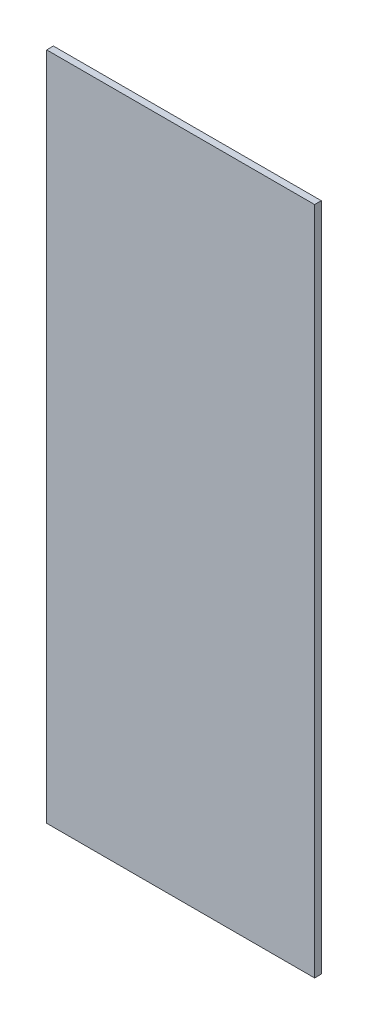
ISO-10303-21;
HEADER;
FILE_DESCRIPTION(('STEP AP214'),'2;1');
FILE_NAME('part.step','',(''),(''),'','','');
FILE_SCHEMA(('AUTOMOTIVE_DESIGN { 1 0 10303 214 1 1 1 1 }'));
ENDSEC;
DATA;
#1=APPLICATION_CONTEXT('core data for automotive mechanical design processes');
#2=APPLICATION_PROTOCOL_DEFINITION('international standard','automotive_design',2000,#1);
#3=PRODUCT_CONTEXT('',#1,'mechanical');
#4=PRODUCT('Part','Part','',(#3));
#5=PRODUCT_RELATED_PRODUCT_CATEGORY('part','',(#4));
#6=PRODUCT_DEFINITION_FORMATION('','',#4);
#7=PRODUCT_DEFINITION_CONTEXT('part definition',#1,'design');
#8=PRODUCT_DEFINITION('design','',#6,#7);
#9=PRODUCT_DEFINITION_SHAPE('','',#8);
#10=(LENGTH_UNIT() NAMED_UNIT(*) SI_UNIT(.MILLI.,.METRE.));
#11=(NAMED_UNIT(*) PLANE_ANGLE_UNIT() SI_UNIT($,.RADIAN.));
#12=(NAMED_UNIT(*) SI_UNIT($,.STERADIAN.) SOLID_ANGLE_UNIT());
#13=UNCERTAINTY_MEASURE_WITH_UNIT(LENGTH_MEASURE(1.E-05),#10,'distance_accuracy_value','');
#14=(GEOMETRIC_REPRESENTATION_CONTEXT(3) GLOBAL_UNCERTAINTY_ASSIGNED_CONTEXT((#13)) GLOBAL_UNIT_ASSIGNED_CONTEXT((#10,
#11,#12)) REPRESENTATION_CONTEXT('',''));
#15=CARTESIAN_POINT('',(0.,0.,0.));
#16=DIRECTION('',(0.,0.,1.));
#17=DIRECTION('',(1.,0.,0.));
#18=AXIS2_PLACEMENT_3D('',#15,#16,#17);
#19=CARTESIAN_POINT('',(63.5,158.75,3.175));
#20=DIRECTION('',(0.,-1.,0.));
#21=DIRECTION('',(0.,0.,-1.));
#22=AXIS2_PLACEMENT_3D('',#19,#20,#21);
#23=PLANE('',#22);
#24=DIRECTION('',(-1.,0.,0.));
#25=VECTOR('',#24,1.);
#26=CARTESIAN_POINT('',(63.5,158.75,0.));
#27=LINE('',#26,#25);
#28=CARTESIAN_POINT('',(63.5,158.75,0.));
#29=VERTEX_POINT('',#28);
#30=CARTESIAN_POINT('',(-63.5,158.75,0.));
#31=VERTEX_POINT('',#30);
#32=EDGE_CURVE('E113',#29,#31,#27,.T.);
#33=ORIENTED_EDGE('',*,*,#32,.T.);
#34=DIRECTION('',(0.,0.,-1.));
#35=VECTOR('',#34,1.);
#36=CARTESIAN_POINT('',(-63.5,158.75,3.175));
#37=LINE('',#36,#35);
#38=CARTESIAN_POINT('',(-63.5,158.75,3.175));
#39=VERTEX_POINT('',#38);
#40=EDGE_CURVE('E11',#39,#31,#37,.T.);
#41=ORIENTED_EDGE('',*,*,#40,.F.);
#42=DIRECTION('',(-1.,0.,0.));
#43=VECTOR('',#42,1.);
#44=CARTESIAN_POINT('',(63.5,158.75,3.175));
#45=LINE('',#44,#43);
#46=CARTESIAN_POINT('',(63.5,158.75,3.175));
#47=VERTEX_POINT('',#46);
#48=EDGE_CURVE('E97',#47,#39,#45,.T.);
#49=ORIENTED_EDGE('',*,*,#48,.F.);
#50=DIRECTION('',(0.,0.,-1.));
#51=VECTOR('',#50,1.);
#52=CARTESIAN_POINT('',(63.5,158.75,3.175));
#53=LINE('',#52,#51);
#54=EDGE_CURVE('E109',#47,#29,#53,.T.);
#55=ORIENTED_EDGE('',*,*,#54,.T.);
#56=EDGE_LOOP('',(#33,#41,#49,#55));
#57=FACE_BOUND('',#56,.T.);
#58=ADVANCED_FACE('F45',(#57),#23,.F.);
#59=CARTESIAN_POINT('',(-63.5,-158.75,3.175));
#60=DIRECTION('',(1.,0.,0.));
#61=DIRECTION('',(0.,0.,-1.));
#62=AXIS2_PLACEMENT_3D('',#59,#60,#61);
#63=PLANE('',#62);
#64=DIRECTION('',(0.,-1.,0.));
#65=VECTOR('',#64,1.);
#66=CARTESIAN_POINT('',(-63.5,-158.75,0.));
#67=LINE('',#66,#65);
#68=CARTESIAN_POINT('',(-63.5,-158.75,0.));
#69=VERTEX_POINT('',#68);
#70=EDGE_CURVE('E102',#31,#69,#67,.T.);
#71=ORIENTED_EDGE('',*,*,#70,.T.);
#72=DIRECTION('',(0.,0.,-1.));
#73=VECTOR('',#72,1.);
#74=CARTESIAN_POINT('',(-63.5,-158.75,3.175));
#75=LINE('',#74,#73);
#76=CARTESIAN_POINT('',(-63.5,-158.75,3.175));
#77=VERTEX_POINT('',#76);
#78=EDGE_CURVE('E54',#77,#69,#75,.T.);
#79=ORIENTED_EDGE('',*,*,#78,.F.);
#80=DIRECTION('',(0.,-1.,0.));
#81=VECTOR('',#80,1.);
#82=CARTESIAN_POINT('',(-63.5,-158.75,3.175));
#83=LINE('',#82,#81);
#84=EDGE_CURVE('E92',#39,#77,#83,.T.);
#85=ORIENTED_EDGE('',*,*,#84,.F.);
#86=ORIENTED_EDGE('',*,*,#40,.T.);
#87=EDGE_LOOP('',(#71,#79,#85,#86));
#88=FACE_BOUND('',#87,.T.);
#89=ADVANCED_FACE('F101',(#88),#63,.F.);
#90=CARTESIAN_POINT('',(63.5,-158.75,3.175));
#91=DIRECTION('',(0.,1.,0.));
#92=DIRECTION('',(0.,0.,1.));
#93=AXIS2_PLACEMENT_3D('',#90,#91,#92);
#94=PLANE('',#93);
#95=DIRECTION('',(1.,0.,0.));
#96=VECTOR('',#95,1.);
#97=CARTESIAN_POINT('',(63.5,-158.75,0.));
#98=LINE('',#97,#96);
#99=CARTESIAN_POINT('',(63.5,-158.75,0.));
#100=VERTEX_POINT('',#99);
#101=EDGE_CURVE('E79',#69,#100,#98,.T.);
#102=ORIENTED_EDGE('',*,*,#101,.T.);
#103=DIRECTION('',(0.,0.,-1.));
#104=VECTOR('',#103,1.);
#105=CARTESIAN_POINT('',(63.5,-158.75,3.175));
#106=LINE('',#105,#104);
#107=CARTESIAN_POINT('',(63.5,-158.75,3.175));
#108=VERTEX_POINT('',#107);
#109=EDGE_CURVE('E104',#108,#100,#106,.T.);
#110=ORIENTED_EDGE('',*,*,#109,.F.);
#111=DIRECTION('',(1.,0.,0.));
#112=VECTOR('',#111,1.);
#113=CARTESIAN_POINT('',(63.5,-158.75,3.175));
#114=LINE('',#113,#112);
#115=EDGE_CURVE('E95',#77,#108,#114,.T.);
#116=ORIENTED_EDGE('',*,*,#115,.F.);
#117=ORIENTED_EDGE('',*,*,#78,.T.);
#118=EDGE_LOOP('',(#102,#110,#116,#117));
#119=FACE_BOUND('',#118,.T.);
#120=ADVANCED_FACE('F105',(#119),#94,.F.);
#121=CARTESIAN_POINT('',(63.5,-158.75,3.175));
#122=DIRECTION('',(-1.,0.,0.));
#123=DIRECTION('',(0.,0.,1.));
#124=AXIS2_PLACEMENT_3D('',#121,#122,#123);
#125=PLANE('',#124);
#126=DIRECTION('',(0.,1.,0.));
#127=VECTOR('',#126,1.);
#128=CARTESIAN_POINT('',(63.5,-158.75,0.));
#129=LINE('',#128,#127);
#130=EDGE_CURVE('E85',#100,#29,#129,.T.);
#131=ORIENTED_EDGE('',*,*,#130,.T.);
#132=ORIENTED_EDGE('',*,*,#54,.F.);
#133=DIRECTION('',(0.,1.,0.));
#134=VECTOR('',#133,1.);
#135=CARTESIAN_POINT('',(63.5,-158.75,3.175));
#136=LINE('',#135,#134);
#137=EDGE_CURVE('E62',#108,#47,#136,.T.);
#138=ORIENTED_EDGE('',*,*,#137,.F.);
#139=ORIENTED_EDGE('',*,*,#109,.T.);
#140=EDGE_LOOP('',(#131,#132,#138,#139));
#141=FACE_BOUND('',#140,.T.);
#142=ADVANCED_FACE('F126',(#141),#125,.F.);
#143=CARTESIAN_POINT('',(0.,0.,3.175));
#144=DIRECTION('',(0.,0.,-1.));
#145=DIRECTION('',(-1.,0.,0.));
#146=AXIS2_PLACEMENT_3D('',#143,#144,#145);
#147=PLANE('',#146);
#148=ORIENTED_EDGE('',*,*,#48,.T.);
#149=ORIENTED_EDGE('',*,*,#84,.T.);
#150=ORIENTED_EDGE('',*,*,#115,.T.);
#151=ORIENTED_EDGE('',*,*,#137,.T.);
#152=EDGE_LOOP('',(#148,#149,#150,#151));
#153=FACE_BOUND('',#152,.T.);
#154=ADVANCED_FACE('F93',(#153),#147,.F.);
#155=CARTESIAN_POINT('',(0.,0.,0.));
#156=DIRECTION('',(0.,0.,-1.));
#157=DIRECTION('',(-1.,0.,0.));
#158=AXIS2_PLACEMENT_3D('',#155,#156,#157);
#159=PLANE('',#158);
#160=ORIENTED_EDGE('',*,*,#32,.F.);
#161=ORIENTED_EDGE('',*,*,#130,.F.);
#162=ORIENTED_EDGE('',*,*,#101,.F.);
#163=ORIENTED_EDGE('',*,*,#70,.F.);
#164=EDGE_LOOP('',(#160,#161,#162,#163));
#165=FACE_BOUND('',#164,.T.);
#166=ADVANCED_FACE('F129',(#165),#159,.T.);
#167=CLOSED_SHELL('',(#58,#89,#120,#142,#154,#166));
#168=MANIFOLD_SOLID_BREP('B2',#167);
#169=ADVANCED_BREP_SHAPE_REPRESENTATION('',(#18,#168),#14);
#170=SHAPE_DEFINITION_REPRESENTATION(#9,#169);
ENDSEC;
END-ISO-10303-21;
